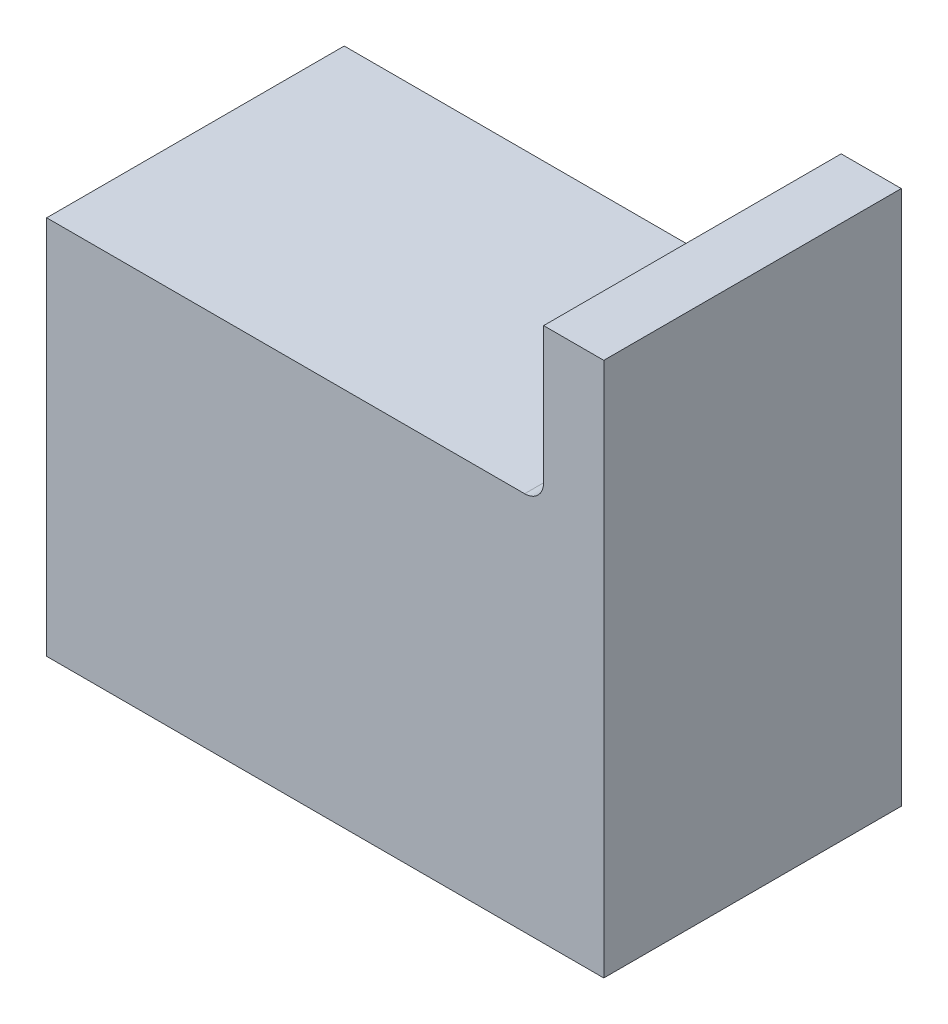
ISO-10303-21;
HEADER;
FILE_DESCRIPTION(('STEP AP214'),'2;1');
FILE_NAME('part.step','',(''),(''),'','','');
FILE_SCHEMA(('AUTOMOTIVE_DESIGN { 1 0 10303 214 1 1 1 1 }'));
ENDSEC;
DATA;
#1=APPLICATION_CONTEXT('core data for automotive mechanical design processes');
#2=APPLICATION_PROTOCOL_DEFINITION('international standard','automotive_design',2000,#1);
#3=PRODUCT_CONTEXT('',#1,'mechanical');
#4=PRODUCT('Part','Part','',(#3));
#5=PRODUCT_RELATED_PRODUCT_CATEGORY('part','',(#4));
#6=PRODUCT_DEFINITION_FORMATION('','',#4);
#7=PRODUCT_DEFINITION_CONTEXT('part definition',#1,'design');
#8=PRODUCT_DEFINITION('design','',#6,#7);
#9=PRODUCT_DEFINITION_SHAPE('','',#8);
#10=(LENGTH_UNIT() NAMED_UNIT(*) SI_UNIT(.MILLI.,.METRE.));
#11=(NAMED_UNIT(*) PLANE_ANGLE_UNIT() SI_UNIT($,.RADIAN.));
#12=(NAMED_UNIT(*) SI_UNIT($,.STERADIAN.) SOLID_ANGLE_UNIT());
#13=UNCERTAINTY_MEASURE_WITH_UNIT(LENGTH_MEASURE(1.E-05),#10,'distance_accuracy_value','');
#14=(GEOMETRIC_REPRESENTATION_CONTEXT(3) GLOBAL_UNCERTAINTY_ASSIGNED_CONTEXT((#13)) GLOBAL_UNIT_ASSIGNED_CONTEXT((#10,
#11,#12)) REPRESENTATION_CONTEXT('',''));
#15=CARTESIAN_POINT('',(0.,0.,0.));
#16=DIRECTION('',(0.,0.,1.));
#17=DIRECTION('',(1.,0.,0.));
#18=AXIS2_PLACEMENT_3D('',#15,#16,#17);
#19=CARTESIAN_POINT('',(25.5,60.,-18.));
#20=DIRECTION('',(0.,-1.,0.));
#21=DIRECTION('',(0.,0.,-1.));
#22=AXIS2_PLACEMENT_3D('',#19,#20,#21);
#23=CYLINDRICAL_SURFACE('',#22,2.5);
#24=CARTESIAN_POINT('',(25.5,0.,-18.));
#25=DIRECTION('',(0.,1.,0.));
#26=DIRECTION('',(0.,0.,1.));
#27=AXIS2_PLACEMENT_3D('',#24,#25,#26);
#28=CIRCLE('',#27,2.5);
#29=CARTESIAN_POINT('',(25.5,0.,-15.5));
#30=VERTEX_POINT('',#29);
#31=EDGE_CURVE('E142',#30,#30,#28,.T.);
#32=ORIENTED_EDGE('',*,*,#31,.F.);
#33=EDGE_LOOP('',(#32));
#34=FACE_BOUND('',#33,.T.);
#35=CARTESIAN_POINT('',(25.5,20.,-18.));
#36=DIRECTION('',(0.,1.,0.));
#37=DIRECTION('',(0.,0.,1.));
#38=AXIS2_PLACEMENT_3D('',#35,#36,#37);
#39=CIRCLE('',#38,2.5);
#40=CARTESIAN_POINT('',(25.5,20.,-15.5));
#41=VERTEX_POINT('',#40);
#42=EDGE_CURVE('E125',#41,#41,#39,.T.);
#43=ORIENTED_EDGE('',*,*,#42,.T.);
#44=EDGE_LOOP('',(#43));
#45=FACE_BOUND('',#44,.T.);
#46=ADVANCED_FACE('F39',(#34,#45),#23,.F.);
#47=CARTESIAN_POINT('',(25.5,60.,18.));
#48=DIRECTION('',(0.,-1.,0.));
#49=DIRECTION('',(0.,0.,-1.));
#50=AXIS2_PLACEMENT_3D('',#47,#48,#49);
#51=CYLINDRICAL_SURFACE('',#50,2.5);
#52=CARTESIAN_POINT('',(25.5,0.,18.));
#53=DIRECTION('',(0.,1.,0.));
#54=DIRECTION('',(0.,0.,-1.));
#55=AXIS2_PLACEMENT_3D('',#52,#53,#54);
#56=CIRCLE('',#55,2.5);
#57=CARTESIAN_POINT('',(25.5,0.,15.5));
#58=VERTEX_POINT('',#57);
#59=EDGE_CURVE('E138',#58,#58,#56,.T.);
#60=ORIENTED_EDGE('',*,*,#59,.F.);
#61=EDGE_LOOP('',(#60));
#62=FACE_BOUND('',#61,.T.);
#63=CARTESIAN_POINT('',(25.5,20.,18.));
#64=DIRECTION('',(0.,1.,0.));
#65=DIRECTION('',(0.,0.,1.));
#66=AXIS2_PLACEMENT_3D('',#63,#64,#65);
#67=CIRCLE('',#66,2.5);
#68=CARTESIAN_POINT('',(25.5,20.,20.5));
#69=VERTEX_POINT('',#68);
#70=EDGE_CURVE('E130',#69,#69,#67,.F.);
#71=ORIENTED_EDGE('',*,*,#70,.F.);
#72=EDGE_LOOP('',(#71));
#73=FACE_BOUND('',#72,.T.);
#74=ADVANCED_FACE('F213',(#62,#73),#51,.F.);
#75=CARTESIAN_POINT('',(0.,60.,0.));
#76=DIRECTION('',(0.,1.,0.));
#77=DIRECTION('',(0.,0.,1.));
#78=AXIS2_PLACEMENT_3D('',#75,#76,#77);
#79=PLANE('',#78);
#80=DIRECTION('',(1.,0.,0.));
#81=VECTOR('',#80,1.);
#82=CARTESIAN_POINT('',(-44.,60.,23.5));
#83=LINE('',#82,#81);
#84=CARTESIAN_POINT('',(-44.,60.,23.5));
#85=VERTEX_POINT('',#84);
#86=CARTESIAN_POINT('',(31.5,60.,23.5));
#87=VERTEX_POINT('',#86);
#88=EDGE_CURVE('E154',#85,#87,#83,.T.);
#89=ORIENTED_EDGE('',*,*,#88,.T.);
#90=DIRECTION('',(0.,0.,1.));
#91=VECTOR('',#90,1.);
#92=CARTESIAN_POINT('',(31.5,60.,0.));
#93=LINE('',#92,#91);
#94=CARTESIAN_POINT('',(31.5,60.,-23.5));
#95=VERTEX_POINT('',#94);
#96=EDGE_CURVE('E61',#87,#95,#93,.F.);
#97=ORIENTED_EDGE('',*,*,#96,.T.);
#98=DIRECTION('',(-1.,0.,0.));
#99=VECTOR('',#98,1.);
#100=CARTESIAN_POINT('',(-44.,60.,-23.5));
#101=LINE('',#100,#99);
#102=CARTESIAN_POINT('',(-44.,60.,-23.5));
#103=VERTEX_POINT('',#102);
#104=EDGE_CURVE('E147',#95,#103,#101,.T.);
#105=ORIENTED_EDGE('',*,*,#104,.T.);
#106=DIRECTION('',(0.,0.,1.));
#107=VECTOR('',#106,1.);
#108=CARTESIAN_POINT('',(-44.,60.,-23.5));
#109=LINE('',#108,#107);
#110=EDGE_CURVE('E150',#103,#85,#109,.T.);
#111=ORIENTED_EDGE('',*,*,#110,.T.);
#112=EDGE_LOOP('',(#89,#97,#105,#111));
#113=FACE_BOUND('',#112,.T.);
#114=ADVANCED_FACE('F206',(#113),#79,.T.);
#115=CARTESIAN_POINT('',(0.,0.,0.));
#116=DIRECTION('',(0.,1.,0.));
#117=DIRECTION('',(0.,0.,1.));
#118=AXIS2_PLACEMENT_3D('',#115,#116,#117);
#119=PLANE('',#118);
#120=DIRECTION('',(0.,0.,-1.));
#121=VECTOR('',#120,1.);
#122=CARTESIAN_POINT('',(44.,0.,-23.5));
#123=LINE('',#122,#121);
#124=CARTESIAN_POINT('',(44.,0.,23.5));
#125=VERTEX_POINT('',#124);
#126=CARTESIAN_POINT('',(44.,0.,-23.5));
#127=VERTEX_POINT('',#126);
#128=EDGE_CURVE('E146',#125,#127,#123,.T.);
#129=ORIENTED_EDGE('',*,*,#128,.F.);
#130=DIRECTION('',(1.,0.,0.));
#131=VECTOR('',#130,1.);
#132=CARTESIAN_POINT('',(-44.,0.,23.5));
#133=LINE('',#132,#131);
#134=CARTESIAN_POINT('',(-44.,0.,23.5));
#135=VERTEX_POINT('',#134);
#136=EDGE_CURVE('E151',#135,#125,#133,.T.);
#137=ORIENTED_EDGE('',*,*,#136,.F.);
#138=DIRECTION('',(0.,0.,1.));
#139=VECTOR('',#138,1.);
#140=CARTESIAN_POINT('',(-44.,0.,-23.5));
#141=LINE('',#140,#139);
#142=CARTESIAN_POINT('',(-44.,0.,-23.5));
#143=VERTEX_POINT('',#142);
#144=EDGE_CURVE('E164',#143,#135,#141,.T.);
#145=ORIENTED_EDGE('',*,*,#144,.F.);
#146=DIRECTION('',(-1.,0.,0.));
#147=VECTOR('',#146,1.);
#148=CARTESIAN_POINT('',(-44.,0.,-23.5));
#149=LINE('',#148,#147);
#150=EDGE_CURVE('E161',#127,#143,#149,.T.);
#151=ORIENTED_EDGE('',*,*,#150,.F.);
#152=EDGE_LOOP('',(#129,#137,#145,#151));
#153=FACE_BOUND('',#152,.T.);
#154=ORIENTED_EDGE('',*,*,#31,.T.);
#155=EDGE_LOOP('',(#154));
#156=FACE_BOUND('',#155,.T.);
#157=ORIENTED_EDGE('',*,*,#59,.T.);
#158=EDGE_LOOP('',(#157));
#159=FACE_BOUND('',#158,.T.);
#160=ADVANCED_FACE('F204',(#153,#156,#159),#119,.F.);
#161=CARTESIAN_POINT('',(44.,60.,-23.5));
#162=DIRECTION('',(-1.,0.,0.));
#163=DIRECTION('',(0.,0.,1.));
#164=AXIS2_PLACEMENT_3D('',#161,#162,#163);
#165=PLANE('',#164);
#166=ORIENTED_EDGE('',*,*,#128,.T.);
#167=DIRECTION('',(0.,-1.,0.));
#168=VECTOR('',#167,1.);
#169=CARTESIAN_POINT('',(44.,60.,-23.5));
#170=LINE('',#169,#168);
#171=CARTESIAN_POINT('',(44.,84.5,-23.5));
#172=VERTEX_POINT('',#171);
#173=EDGE_CURVE('E180',#172,#127,#170,.T.);
#174=ORIENTED_EDGE('',*,*,#173,.F.);
#175=DIRECTION('',(0.,0.,1.));
#176=VECTOR('',#175,1.);
#177=CARTESIAN_POINT('',(44.,84.5,-23.5));
#178=LINE('',#177,#176);
#179=CARTESIAN_POINT('',(44.,84.5,23.5));
#180=VERTEX_POINT('',#179);
#181=EDGE_CURVE('E117',#172,#180,#178,.T.);
#182=ORIENTED_EDGE('',*,*,#181,.T.);
#183=DIRECTION('',(0.,-1.,0.));
#184=VECTOR('',#183,1.);
#185=CARTESIAN_POINT('',(44.,60.,23.5));
#186=LINE('',#185,#184);
#187=EDGE_CURVE('E157',#180,#125,#186,.T.);
#188=ORIENTED_EDGE('',*,*,#187,.T.);
#189=EDGE_LOOP('',(#166,#174,#182,#188));
#190=FACE_BOUND('',#189,.T.);
#191=ADVANCED_FACE('F194',(#190),#165,.F.);
#192=CARTESIAN_POINT('',(-44.,60.,-23.5));
#193=DIRECTION('',(0.,0.,1.));
#194=DIRECTION('',(1.,0.,0.));
#195=AXIS2_PLACEMENT_3D('',#192,#193,#194);
#196=PLANE('',#195);
#197=ORIENTED_EDGE('',*,*,#150,.T.);
#198=DIRECTION('',(0.,-1.,0.));
#199=VECTOR('',#198,1.);
#200=CARTESIAN_POINT('',(-44.,60.,-23.5));
#201=LINE('',#200,#199);
#202=EDGE_CURVE('E176',#103,#143,#201,.T.);
#203=ORIENTED_EDGE('',*,*,#202,.F.);
#204=ORIENTED_EDGE('',*,*,#104,.F.);
#205=CARTESIAN_POINT('',(31.5,63.,-23.5));
#206=DIRECTION('',(0.,0.,1.));
#207=DIRECTION('',(1.,0.,0.));
#208=AXIS2_PLACEMENT_3D('',#205,#206,#207);
#209=CIRCLE('',#208,3.);
#210=CARTESIAN_POINT('',(34.5,63.,-23.5));
#211=VERTEX_POINT('',#210);
#212=EDGE_CURVE('E11',#95,#211,#209,.T.);
#213=ORIENTED_EDGE('',*,*,#212,.T.);
#214=DIRECTION('',(0.,-1.,0.));
#215=VECTOR('',#214,1.);
#216=CARTESIAN_POINT('',(34.5,84.5,-23.5));
#217=LINE('',#216,#215);
#218=CARTESIAN_POINT('',(34.5,84.5,-23.5));
#219=VERTEX_POINT('',#218);
#220=EDGE_CURVE('E103',#219,#211,#217,.T.);
#221=ORIENTED_EDGE('',*,*,#220,.F.);
#222=DIRECTION('',(-1.,0.,0.));
#223=VECTOR('',#222,1.);
#224=CARTESIAN_POINT('',(44.,84.5,-23.5));
#225=LINE('',#224,#223);
#226=EDGE_CURVE('E111',#172,#219,#225,.T.);
#227=ORIENTED_EDGE('',*,*,#226,.F.);
#228=ORIENTED_EDGE('',*,*,#173,.T.);
#229=EDGE_LOOP('',(#197,#203,#204,#213,#221,#227,#228));
#230=FACE_BOUND('',#229,.T.);
#231=ADVANCED_FACE('F122',(#230),#196,.F.);
#232=CARTESIAN_POINT('',(-44.,60.,-23.5));
#233=DIRECTION('',(1.,0.,0.));
#234=DIRECTION('',(0.,0.,-1.));
#235=AXIS2_PLACEMENT_3D('',#232,#233,#234);
#236=PLANE('',#235);
#237=ORIENTED_EDGE('',*,*,#144,.T.);
#238=DIRECTION('',(0.,-1.,0.));
#239=VECTOR('',#238,1.);
#240=CARTESIAN_POINT('',(-44.,60.,23.5));
#241=LINE('',#240,#239);
#242=EDGE_CURVE('E172',#85,#135,#241,.T.);
#243=ORIENTED_EDGE('',*,*,#242,.F.);
#244=ORIENTED_EDGE('',*,*,#110,.F.);
#245=ORIENTED_EDGE('',*,*,#202,.T.);
#246=EDGE_LOOP('',(#237,#243,#244,#245));
#247=FACE_BOUND('',#246,.T.);
#248=ADVANCED_FACE('F201',(#247),#236,.F.);
#249=CARTESIAN_POINT('',(-44.,60.,23.5));
#250=DIRECTION('',(0.,0.,-1.));
#251=DIRECTION('',(-1.,0.,0.));
#252=AXIS2_PLACEMENT_3D('',#249,#250,#251);
#253=PLANE('',#252);
#254=ORIENTED_EDGE('',*,*,#136,.T.);
#255=ORIENTED_EDGE('',*,*,#187,.F.);
#256=DIRECTION('',(-1.,0.,0.));
#257=VECTOR('',#256,1.);
#258=CARTESIAN_POINT('',(44.,84.5,23.5));
#259=LINE('',#258,#257);
#260=CARTESIAN_POINT('',(34.5,84.5,23.5));
#261=VERTEX_POINT('',#260);
#262=EDGE_CURVE('E110',#180,#261,#259,.T.);
#263=ORIENTED_EDGE('',*,*,#262,.T.);
#264=DIRECTION('',(0.,-1.,0.));
#265=VECTOR('',#264,1.);
#266=CARTESIAN_POINT('',(34.5,84.5,23.5));
#267=LINE('',#266,#265);
#268=CARTESIAN_POINT('',(34.5,63.,23.5));
#269=VERTEX_POINT('',#268);
#270=EDGE_CURVE('E105',#261,#269,#267,.T.);
#271=ORIENTED_EDGE('',*,*,#270,.T.);
#272=CARTESIAN_POINT('',(31.5,63.,23.5));
#273=DIRECTION('',(0.,0.,-1.));
#274=DIRECTION('',(-1.,0.,0.));
#275=AXIS2_PLACEMENT_3D('',#272,#273,#274);
#276=CIRCLE('',#275,3.);
#277=EDGE_CURVE('E48',#269,#87,#276,.T.);
#278=ORIENTED_EDGE('',*,*,#277,.T.);
#279=ORIENTED_EDGE('',*,*,#88,.F.);
#280=ORIENTED_EDGE('',*,*,#242,.T.);
#281=EDGE_LOOP('',(#254,#255,#263,#271,#278,#279,#280));
#282=FACE_BOUND('',#281,.T.);
#283=ADVANCED_FACE('F189',(#282),#253,.F.);
#284=CARTESIAN_POINT('',(0.,20.,0.));
#285=DIRECTION('',(0.,1.,0.));
#286=DIRECTION('',(0.,0.,1.));
#287=AXIS2_PLACEMENT_3D('',#284,#285,#286);
#288=PLANE('',#287);
#289=ORIENTED_EDGE('',*,*,#70,.T.);
#290=EDGE_LOOP('',(#289));
#291=FACE_BOUND('',#290,.T.);
#292=ADVANCED_FACE('F231',(#291),#288,.F.);
#293=CARTESIAN_POINT('',(0.,20.,0.));
#294=DIRECTION('',(0.,1.,0.));
#295=DIRECTION('',(0.,0.,1.));
#296=AXIS2_PLACEMENT_3D('',#293,#294,#295);
#297=PLANE('',#296);
#298=ORIENTED_EDGE('',*,*,#42,.F.);
#299=EDGE_LOOP('',(#298));
#300=FACE_BOUND('',#299,.T.);
#301=ADVANCED_FACE('F262',(#300),#297,.F.);
#302=CARTESIAN_POINT('',(34.5,84.5,-23.5));
#303=DIRECTION('',(1.,0.,0.));
#304=DIRECTION('',(0.,0.,-1.));
#305=AXIS2_PLACEMENT_3D('',#302,#303,#304);
#306=PLANE('',#305);
#307=ORIENTED_EDGE('',*,*,#220,.T.);
#308=DIRECTION('',(0.,0.,1.));
#309=VECTOR('',#308,1.);
#310=CARTESIAN_POINT('',(34.5,63.,-23.5));
#311=LINE('',#310,#309);
#312=EDGE_CURVE('E183',#211,#269,#311,.T.);
#313=ORIENTED_EDGE('',*,*,#312,.T.);
#314=ORIENTED_EDGE('',*,*,#270,.F.);
#315=DIRECTION('',(0.,0.,1.));
#316=VECTOR('',#315,1.);
#317=CARTESIAN_POINT('',(34.5,84.5,-23.5));
#318=LINE('',#317,#316);
#319=EDGE_CURVE('E98',#219,#261,#318,.T.);
#320=ORIENTED_EDGE('',*,*,#319,.F.);
#321=EDGE_LOOP('',(#307,#313,#314,#320));
#322=FACE_BOUND('',#321,.T.);
#323=ADVANCED_FACE('F100',(#322),#306,.F.);
#324=CARTESIAN_POINT('',(0.,84.5,0.));
#325=DIRECTION('',(0.,1.,0.));
#326=DIRECTION('',(0.,0.,1.));
#327=AXIS2_PLACEMENT_3D('',#324,#325,#326);
#328=PLANE('',#327);
#329=ORIENTED_EDGE('',*,*,#226,.T.);
#330=ORIENTED_EDGE('',*,*,#319,.T.);
#331=ORIENTED_EDGE('',*,*,#262,.F.);
#332=ORIENTED_EDGE('',*,*,#181,.F.);
#333=EDGE_LOOP('',(#329,#330,#331,#332));
#334=FACE_BOUND('',#333,.T.);
#335=ADVANCED_FACE('F115',(#334),#328,.T.);
#336=CARTESIAN_POINT('',(31.5,63.,-23.5));
#337=DIRECTION('',(0.,0.,1.));
#338=DIRECTION('',(1.,0.,0.));
#339=AXIS2_PLACEMENT_3D('',#336,#337,#338);
#340=CYLINDRICAL_SURFACE('',#339,3.);
#341=ORIENTED_EDGE('',*,*,#212,.F.);
#342=ORIENTED_EDGE('',*,*,#96,.F.);
#343=ORIENTED_EDGE('',*,*,#277,.F.);
#344=ORIENTED_EDGE('',*,*,#312,.F.);
#345=EDGE_LOOP('',(#341,#342,#343,#344));
#346=FACE_BOUND('',#345,.T.);
#347=ADVANCED_FACE('F41',(#346),#340,.F.);
#348=CLOSED_SHELL('',(#46,#74,#114,#160,#191,#231,#248,#283,#292,#301,#323,#335,#347));
#349=MANIFOLD_SOLID_BREP('B2',#348);
#350=ADVANCED_BREP_SHAPE_REPRESENTATION('',(#18,#349),#14);
#351=SHAPE_DEFINITION_REPRESENTATION(#9,#350);
ENDSEC;
END-ISO-10303-21;
